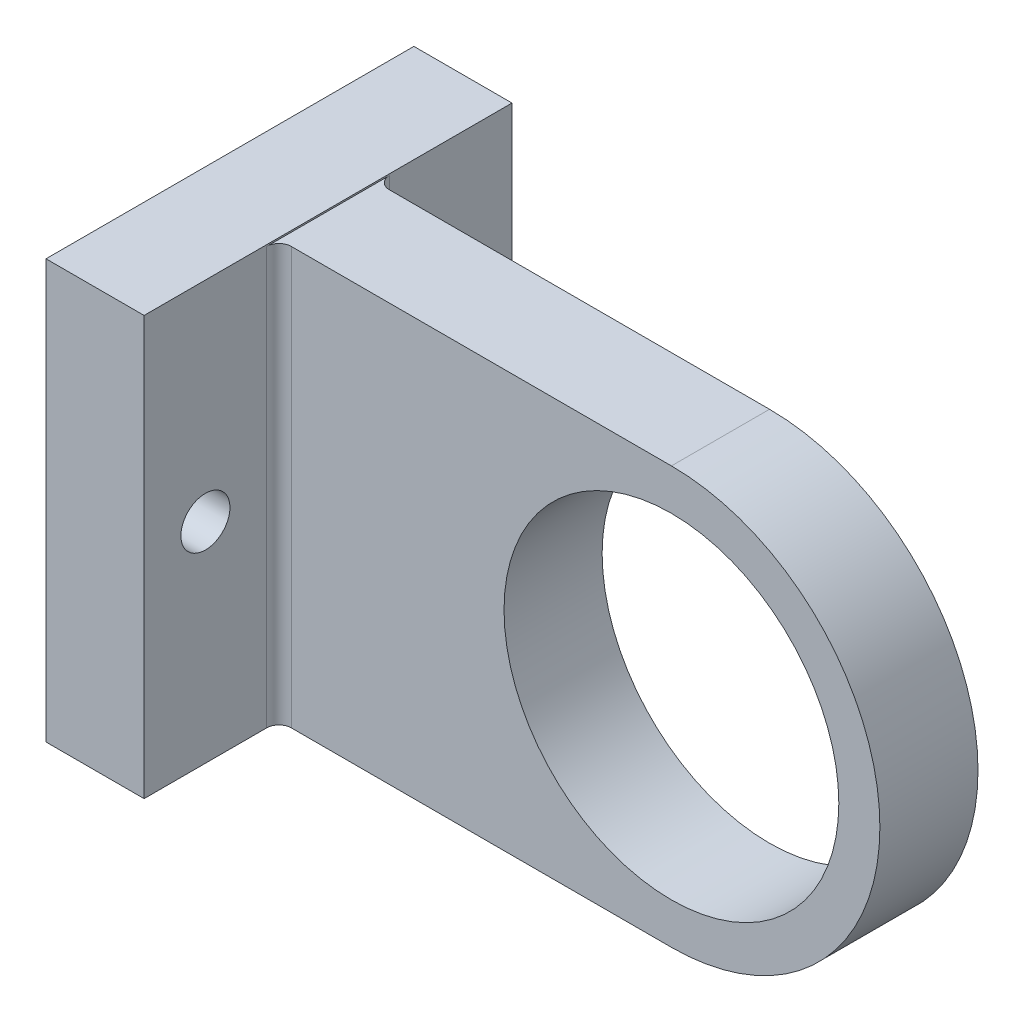
ISO-10303-21;
HEADER;
FILE_DESCRIPTION(('STEP AP214'),'2;1');
FILE_NAME('part.step','',(''),(''),'','','');
FILE_SCHEMA(('AUTOMOTIVE_DESIGN { 1 0 10303 214 1 1 1 1 }'));
ENDSEC;
DATA;
#1=APPLICATION_CONTEXT('core data for automotive mechanical design processes');
#2=APPLICATION_PROTOCOL_DEFINITION('international standard','automotive_design',2000,#1);
#3=PRODUCT_CONTEXT('',#1,'mechanical');
#4=PRODUCT('Part','Part','',(#3));
#5=PRODUCT_RELATED_PRODUCT_CATEGORY('part','',(#4));
#6=PRODUCT_DEFINITION_FORMATION('','',#4);
#7=PRODUCT_DEFINITION_CONTEXT('part definition',#1,'design');
#8=PRODUCT_DEFINITION('design','',#6,#7);
#9=PRODUCT_DEFINITION_SHAPE('','',#8);
#10=(LENGTH_UNIT() NAMED_UNIT(*) SI_UNIT(.MILLI.,.METRE.));
#11=(NAMED_UNIT(*) PLANE_ANGLE_UNIT() SI_UNIT($,.RADIAN.));
#12=(NAMED_UNIT(*) SI_UNIT($,.STERADIAN.) SOLID_ANGLE_UNIT());
#13=UNCERTAINTY_MEASURE_WITH_UNIT(LENGTH_MEASURE(1.E-05),#10,'distance_accuracy_value','');
#14=(GEOMETRIC_REPRESENTATION_CONTEXT(3) GLOBAL_UNCERTAINTY_ASSIGNED_CONTEXT((#13)) GLOBAL_UNIT_ASSIGNED_CONTEXT((#10,
#11,#12)) REPRESENTATION_CONTEXT('',''));
#15=CARTESIAN_POINT('',(0.,0.,0.));
#16=DIRECTION('',(0.,0.,1.));
#17=DIRECTION('',(1.,0.,0.));
#18=AXIS2_PLACEMENT_3D('',#15,#16,#17);
#19=CARTESIAN_POINT('',(22.9128784747792,-0.887716477004379,8.));
#20=DIRECTION('',(0.,0.,1.));
#21=DIRECTION('',(1.,0.,0.));
#22=AXIS2_PLACEMENT_3D('',#19,#20,#21);
#23=PLANE('',#22);
#24=CARTESIAN_POINT('',(22.9128784747792,-0.887716477004379,8.));
#25=DIRECTION('',(0.,0.,1.));
#26=DIRECTION('',(1.,0.,0.));
#27=AXIS2_PLACEMENT_3D('',#24,#25,#26);
#28=CIRCLE('',#27,13.65);
#29=CARTESIAN_POINT('',(36.5628784747792,-0.887716477004379,8.));
#30=VERTEX_POINT('',#29);
#31=EDGE_CURVE('E180',#30,#30,#28,.T.);
#32=ORIENTED_EDGE('',*,*,#31,.F.);
#33=EDGE_LOOP('',(#32));
#34=FACE_BOUND('',#33,.T.);
#35=DIRECTION('',(-1.,0.,0.));
#36=VECTOR('',#35,1.);
#37=CARTESIAN_POINT('',(22.9128784747792,16.1122835229956,8.));
#38=LINE('',#37,#36);
#39=CARTESIAN_POINT('',(22.9128784747792,16.1122835229956,8.));
#40=VERTEX_POINT('',#39);
#41=CARTESIAN_POINT('',(-8.0871215252208,16.1122835229956,8.));
#42=VERTEX_POINT('',#41);
#43=EDGE_CURVE('E192',#40,#42,#38,.T.);
#44=ORIENTED_EDGE('',*,*,#43,.T.);
#45=DIRECTION('',(0.,-1.,0.));
#46=VECTOR('',#45,1.);
#47=CARTESIAN_POINT('',(-8.0871215252208,-0.887716477004385,8.));
#48=LINE('',#47,#46);
#49=CARTESIAN_POINT('',(-8.0871215252208,-17.8877164770044,8.));
#50=VERTEX_POINT('',#49);
#51=EDGE_CURVE('E227',#42,#50,#48,.T.);
#52=ORIENTED_EDGE('',*,*,#51,.T.);
#53=DIRECTION('',(1.,0.,0.));
#54=VECTOR('',#53,1.);
#55=CARTESIAN_POINT('',(22.9128784747792,-17.8877164770044,8.));
#56=LINE('',#55,#54);
#57=CARTESIAN_POINT('',(22.9128784747792,-17.8877164770044,8.));
#58=VERTEX_POINT('',#57);
#59=EDGE_CURVE('E196',#50,#58,#56,.T.);
#60=ORIENTED_EDGE('',*,*,#59,.T.);
#61=CARTESIAN_POINT('',(22.9128784747792,-0.887716477004379,8.));
#62=DIRECTION('',(0.,0.,1.));
#63=DIRECTION('',(1.,0.,0.));
#64=AXIS2_PLACEMENT_3D('',#61,#62,#63);
#65=CIRCLE('',#64,17.);
#66=EDGE_CURVE('E188',#58,#40,#65,.T.);
#67=ORIENTED_EDGE('',*,*,#66,.T.);
#68=EDGE_LOOP('',(#44,#52,#60,#67));
#69=FACE_BOUND('',#68,.T.);
#70=ADVANCED_FACE('F39',(#34,#69),#23,.T.);
#71=CARTESIAN_POINT('',(22.9128784747792,-0.887716477004379,0.));
#72=DIRECTION('',(0.,0.,1.));
#73=DIRECTION('',(1.,0.,0.));
#74=AXIS2_PLACEMENT_3D('',#71,#72,#73);
#75=PLANE('',#74);
#76=CARTESIAN_POINT('',(22.9128784747792,-0.887716477004379,0.));
#77=DIRECTION('',(0.,0.,1.));
#78=DIRECTION('',(1.,0.,0.));
#79=AXIS2_PLACEMENT_3D('',#76,#77,#78);
#80=CIRCLE('',#79,13.65);
#81=CARTESIAN_POINT('',(36.5628784747792,-0.887716477004379,0.));
#82=VERTEX_POINT('',#81);
#83=EDGE_CURVE('E179',#82,#82,#80,.T.);
#84=ORIENTED_EDGE('',*,*,#83,.T.);
#85=EDGE_LOOP('',(#84));
#86=FACE_BOUND('',#85,.T.);
#87=DIRECTION('',(1.,0.,0.));
#88=VECTOR('',#87,1.);
#89=CARTESIAN_POINT('',(22.9128784747792,-17.8877164770044,0.));
#90=LINE('',#89,#88);
#91=CARTESIAN_POINT('',(-8.0871215252208,-17.8877164770044,0.));
#92=VERTEX_POINT('',#91);
#93=CARTESIAN_POINT('',(22.9128784747792,-17.8877164770044,0.));
#94=VERTEX_POINT('',#93);
#95=EDGE_CURVE('E193',#92,#94,#90,.T.);
#96=ORIENTED_EDGE('',*,*,#95,.F.);
#97=DIRECTION('',(0.,-1.,0.));
#98=VECTOR('',#97,1.);
#99=CARTESIAN_POINT('',(-8.0871215252208,16.1122835229956,0.));
#100=LINE('',#99,#98);
#101=CARTESIAN_POINT('',(-8.0871215252208,16.1122835229956,0.));
#102=VERTEX_POINT('',#101);
#103=EDGE_CURVE('E224',#92,#102,#100,.F.);
#104=ORIENTED_EDGE('',*,*,#103,.T.);
#105=DIRECTION('',(-1.,0.,0.));
#106=VECTOR('',#105,1.);
#107=CARTESIAN_POINT('',(22.9128784747792,16.1122835229956,0.));
#108=LINE('',#107,#106);
#109=CARTESIAN_POINT('',(22.9128784747792,16.1122835229956,0.));
#110=VERTEX_POINT('',#109);
#111=EDGE_CURVE('E203',#110,#102,#108,.T.);
#112=ORIENTED_EDGE('',*,*,#111,.F.);
#113=CARTESIAN_POINT('',(22.9128784747792,-0.887716477004379,0.));
#114=DIRECTION('',(0.,0.,1.));
#115=DIRECTION('',(1.,0.,0.));
#116=AXIS2_PLACEMENT_3D('',#113,#114,#115);
#117=CIRCLE('',#116,17.);
#118=EDGE_CURVE('E184',#94,#110,#117,.T.);
#119=ORIENTED_EDGE('',*,*,#118,.F.);
#120=EDGE_LOOP('',(#96,#104,#112,#119));
#121=FACE_BOUND('',#120,.T.);
#122=ADVANCED_FACE('F286',(#86,#121),#75,.F.);
#123=CARTESIAN_POINT('',(22.9128784747792,16.1122835229956,8.));
#124=DIRECTION('',(0.,-1.,0.));
#125=DIRECTION('',(0.,0.,-1.));
#126=AXIS2_PLACEMENT_3D('',#123,#124,#125);
#127=PLANE('',#126);
#128=DIRECTION('',(0.,0.,-1.));
#129=VECTOR('',#128,1.);
#130=CARTESIAN_POINT('',(-9.0871215252208,16.1122835229956,8.));
#131=LINE('',#130,#129);
#132=CARTESIAN_POINT('',(-9.0871215252208,16.1122835229956,9.));
#133=VERTEX_POINT('',#132);
#134=CARTESIAN_POINT('',(-9.0871215252208,16.1122835229956,-1.));
#135=VERTEX_POINT('',#134);
#136=EDGE_CURVE('E171',#133,#135,#131,.T.);
#137=ORIENTED_EDGE('',*,*,#136,.F.);
#138=CARTESIAN_POINT('',(-8.0871215252208,16.1122835229956,9.));
#139=DIRECTION('',(0.,-1.,0.));
#140=DIRECTION('',(0.,0.,-1.));
#141=AXIS2_PLACEMENT_3D('',#138,#139,#140);
#142=CIRCLE('',#141,1.);
#143=EDGE_CURVE('E11',#133,#42,#142,.T.);
#144=ORIENTED_EDGE('',*,*,#143,.T.);
#145=ORIENTED_EDGE('',*,*,#43,.F.);
#146=DIRECTION('',(0.,0.,-1.));
#147=VECTOR('',#146,1.);
#148=CARTESIAN_POINT('',(22.9128784747792,16.1122835229956,8.));
#149=LINE('',#148,#147);
#150=EDGE_CURVE('E214',#40,#110,#149,.T.);
#151=ORIENTED_EDGE('',*,*,#150,.T.);
#152=ORIENTED_EDGE('',*,*,#111,.T.);
#153=CARTESIAN_POINT('',(-8.0871215252208,16.1122835229956,-1.));
#154=DIRECTION('',(0.,-1.,0.));
#155=DIRECTION('',(0.,0.,-1.));
#156=AXIS2_PLACEMENT_3D('',#153,#154,#155);
#157=CIRCLE('',#156,1.);
#158=EDGE_CURVE('E233',#102,#135,#157,.T.);
#159=ORIENTED_EDGE('',*,*,#158,.T.);
#160=EDGE_LOOP('',(#137,#144,#145,#151,#152,#159));
#161=FACE_BOUND('',#160,.T.);
#162=ADVANCED_FACE('F280',(#161),#127,.F.);
#163=CARTESIAN_POINT('',(22.9128784747792,-0.887716477004379,8.));
#164=DIRECTION('',(0.,0.,-1.));
#165=DIRECTION('',(-1.,0.,0.));
#166=AXIS2_PLACEMENT_3D('',#163,#164,#165);
#167=CYLINDRICAL_SURFACE('',#166,17.);
#168=ORIENTED_EDGE('',*,*,#118,.T.);
#169=ORIENTED_EDGE('',*,*,#150,.F.);
#170=ORIENTED_EDGE('',*,*,#66,.F.);
#171=DIRECTION('',(0.,0.,-1.));
#172=VECTOR('',#171,1.);
#173=CARTESIAN_POINT('',(22.9128784747792,-17.8877164770044,8.));
#174=LINE('',#173,#172);
#175=EDGE_CURVE('E199',#58,#94,#174,.T.);
#176=ORIENTED_EDGE('',*,*,#175,.T.);
#177=EDGE_LOOP('',(#168,#169,#170,#176));
#178=FACE_BOUND('',#177,.T.);
#179=ADVANCED_FACE('F260',(#178),#167,.T.);
#180=CARTESIAN_POINT('',(-17.0871215252208,16.1122835229956,8.));
#181=DIRECTION('',(1.,0.,0.));
#182=DIRECTION('',(0.,1.,0.));
#183=AXIS2_PLACEMENT_3D('',#180,#181,#182);
#184=PLANE('',#183);
#185=CARTESIAN_POINT('',(-17.0871215252208,-0.82426124868314,14.));
#186=DIRECTION('',(-1.,0.,0.));
#187=DIRECTION('',(0.,-1.,0.));
#188=AXIS2_PLACEMENT_3D('',#185,#186,#187);
#189=CIRCLE('',#188,2.);
#190=CARTESIAN_POINT('',(-17.0871215252208,-2.82426124868314,14.));
#191=VERTEX_POINT('',#190);
#192=EDGE_CURVE('E241',#191,#191,#189,.T.);
#193=ORIENTED_EDGE('',*,*,#192,.F.);
#194=EDGE_LOOP('',(#193));
#195=FACE_BOUND('',#194,.T.);
#196=CARTESIAN_POINT('',(-17.0871215252208,-0.82426124868314,-6.));
#197=DIRECTION('',(-1.,0.,0.));
#198=DIRECTION('',(0.,-1.,0.));
#199=AXIS2_PLACEMENT_3D('',#196,#197,#198);
#200=CIRCLE('',#199,2.);
#201=CARTESIAN_POINT('',(-17.0871215252208,-2.82426124868314,-6.));
#202=VERTEX_POINT('',#201);
#203=EDGE_CURVE('E155',#202,#202,#200,.T.);
#204=ORIENTED_EDGE('',*,*,#203,.F.);
#205=EDGE_LOOP('',(#204));
#206=FACE_BOUND('',#205,.T.);
#207=DIRECTION('',(0.,0.,-1.));
#208=VECTOR('',#207,1.);
#209=CARTESIAN_POINT('',(-17.0871215252208,-17.8877164770044,8.));
#210=LINE('',#209,#208);
#211=CARTESIAN_POINT('',(-17.0871215252208,-17.8877164770044,19.));
#212=VERTEX_POINT('',#211);
#213=CARTESIAN_POINT('',(-17.0871215252208,-17.8877164770044,-11.));
#214=VERTEX_POINT('',#213);
#215=EDGE_CURVE('E122',#212,#214,#210,.T.);
#216=ORIENTED_EDGE('',*,*,#215,.F.);
#217=DIRECTION('',(0.,1.,0.));
#218=VECTOR('',#217,1.);
#219=CARTESIAN_POINT('',(-17.0871215252208,16.2391939796381,19.));
#220=LINE('',#219,#218);
#221=CARTESIAN_POINT('',(-17.0871215252208,16.2391939796381,19.));
#222=VERTEX_POINT('',#221);
#223=EDGE_CURVE('E152',#212,#222,#220,.T.);
#224=ORIENTED_EDGE('',*,*,#223,.T.);
#225=DIRECTION('',(0.,0.,-1.));
#226=VECTOR('',#225,1.);
#227=CARTESIAN_POINT('',(-17.0871215252208,16.2391939796381,-11.));
#228=LINE('',#227,#226);
#229=CARTESIAN_POINT('',(-17.0871215252208,16.2391939796381,-11.));
#230=VERTEX_POINT('',#229);
#231=EDGE_CURVE('E147',#222,#230,#228,.T.);
#232=ORIENTED_EDGE('',*,*,#231,.T.);
#233=DIRECTION('',(0.,-1.,0.));
#234=VECTOR('',#233,1.);
#235=CARTESIAN_POINT('',(-17.0871215252208,16.2391939796381,-11.));
#236=LINE('',#235,#234);
#237=EDGE_CURVE('E163',#230,#214,#236,.T.);
#238=ORIENTED_EDGE('',*,*,#237,.T.);
#239=EDGE_LOOP('',(#216,#224,#232,#238));
#240=FACE_BOUND('',#239,.T.);
#241=ADVANCED_FACE('F257',(#195,#206,#240),#184,.F.);
#242=CARTESIAN_POINT('',(22.9128784747792,-17.8877164770044,8.));
#243=DIRECTION('',(0.,1.,0.));
#244=DIRECTION('',(-1.,0.,0.));
#245=AXIS2_PLACEMENT_3D('',#242,#243,#244);
#246=PLANE('',#245);
#247=ORIENTED_EDGE('',*,*,#215,.T.);
#248=DIRECTION('',(-1.,0.,0.));
#249=VECTOR('',#248,1.);
#250=CARTESIAN_POINT('',(-9.0871215252208,-17.8877164770044,-11.));
#251=LINE('',#250,#249);
#252=CARTESIAN_POINT('',(-9.0871215252208,-17.8877164770044,-11.));
#253=VERTEX_POINT('',#252);
#254=EDGE_CURVE('E117',#253,#214,#251,.T.);
#255=ORIENTED_EDGE('',*,*,#254,.F.);
#256=DIRECTION('',(0.,0.,1.));
#257=VECTOR('',#256,1.);
#258=CARTESIAN_POINT('',(-9.0871215252208,-17.8877164770044,-11.));
#259=LINE('',#258,#257);
#260=CARTESIAN_POINT('',(-9.0871215252208,-17.8877164770044,-1.));
#261=VERTEX_POINT('',#260);
#262=EDGE_CURVE('E120',#253,#261,#259,.T.);
#263=ORIENTED_EDGE('',*,*,#262,.T.);
#264=CARTESIAN_POINT('',(-8.0871215252208,-17.8877164770044,-1.));
#265=DIRECTION('',(0.,1.,0.));
#266=DIRECTION('',(-1.,0.,0.));
#267=AXIS2_PLACEMENT_3D('',#264,#265,#266);
#268=CIRCLE('',#267,1.);
#269=EDGE_CURVE('E230',#261,#92,#268,.T.);
#270=ORIENTED_EDGE('',*,*,#269,.T.);
#271=ORIENTED_EDGE('',*,*,#95,.T.);
#272=ORIENTED_EDGE('',*,*,#175,.F.);
#273=ORIENTED_EDGE('',*,*,#59,.F.);
#274=CARTESIAN_POINT('',(-8.0871215252208,-17.8877164770044,9.));
#275=DIRECTION('',(0.,1.,0.));
#276=DIRECTION('',(-1.,0.,0.));
#277=AXIS2_PLACEMENT_3D('',#274,#275,#276);
#278=CIRCLE('',#277,1.);
#279=CARTESIAN_POINT('',(-9.0871215252208,-17.8877164770044,9.));
#280=VERTEX_POINT('',#279);
#281=EDGE_CURVE('E49',#50,#280,#278,.T.);
#282=ORIENTED_EDGE('',*,*,#281,.T.);
#283=CARTESIAN_POINT('',(-9.0871215252208,-17.8877164770044,19.));
#284=VERTEX_POINT('',#283);
#285=EDGE_CURVE('E142',#280,#284,#259,.T.);
#286=ORIENTED_EDGE('',*,*,#285,.T.);
#287=DIRECTION('',(-1.,0.,0.));
#288=VECTOR('',#287,1.);
#289=CARTESIAN_POINT('',(-9.0871215252208,-17.8877164770044,19.));
#290=LINE('',#289,#288);
#291=EDGE_CURVE('E128',#284,#212,#290,.T.);
#292=ORIENTED_EDGE('',*,*,#291,.T.);
#293=EDGE_LOOP('',(#247,#255,#263,#270,#271,#272,#273,#282,#286,#292));
#294=FACE_BOUND('',#293,.T.);
#295=ADVANCED_FACE('F119',(#294),#246,.F.);
#296=CARTESIAN_POINT('',(22.9128784747792,-0.887716477004379,8.));
#297=DIRECTION('',(0.,0.,-1.));
#298=DIRECTION('',(-1.,0.,0.));
#299=AXIS2_PLACEMENT_3D('',#296,#297,#298);
#300=CYLINDRICAL_SURFACE('',#299,13.65);
#301=ORIENTED_EDGE('',*,*,#31,.T.);
#302=EDGE_LOOP('',(#301));
#303=FACE_BOUND('',#302,.T.);
#304=ORIENTED_EDGE('',*,*,#83,.F.);
#305=EDGE_LOOP('',(#304));
#306=FACE_BOUND('',#305,.T.);
#307=ADVANCED_FACE('F300',(#303,#306),#300,.F.);
#308=CARTESIAN_POINT('',(-9.08712152522081,16.2391939796381,-11.));
#309=DIRECTION('',(0.,0.,-1.));
#310=DIRECTION('',(0.,1.,0.));
#311=AXIS2_PLACEMENT_3D('',#308,#309,#310);
#312=PLANE('',#311);
#313=ORIENTED_EDGE('',*,*,#237,.F.);
#314=DIRECTION('',(-1.,0.,0.));
#315=VECTOR('',#314,1.);
#316=CARTESIAN_POINT('',(-9.08712152522081,16.2391939796381,-11.));
#317=LINE('',#316,#315);
#318=CARTESIAN_POINT('',(-9.08712152522081,16.2391939796381,-11.));
#319=VERTEX_POINT('',#318);
#320=EDGE_CURVE('E145',#319,#230,#317,.T.);
#321=ORIENTED_EDGE('',*,*,#320,.F.);
#322=DIRECTION('',(0.,-1.,0.));
#323=VECTOR('',#322,1.);
#324=CARTESIAN_POINT('',(-9.08712152522081,16.2391939796381,-11.));
#325=LINE('',#324,#323);
#326=EDGE_CURVE('E136',#319,#253,#325,.T.);
#327=ORIENTED_EDGE('',*,*,#326,.T.);
#328=ORIENTED_EDGE('',*,*,#254,.T.);
#329=EDGE_LOOP('',(#313,#321,#327,#328));
#330=FACE_BOUND('',#329,.T.);
#331=ADVANCED_FACE('F144',(#330),#312,.T.);
#332=CARTESIAN_POINT('',(-9.08712152522081,16.2391939796381,-11.));
#333=DIRECTION('',(0.,1.,0.));
#334=DIRECTION('',(0.,0.,1.));
#335=AXIS2_PLACEMENT_3D('',#332,#333,#334);
#336=PLANE('',#335);
#337=ORIENTED_EDGE('',*,*,#231,.F.);
#338=DIRECTION('',(-1.,0.,0.));
#339=VECTOR('',#338,1.);
#340=CARTESIAN_POINT('',(-9.08712152522081,16.2391939796381,19.));
#341=LINE('',#340,#339);
#342=CARTESIAN_POINT('',(-9.08712152522081,16.2391939796381,19.));
#343=VERTEX_POINT('',#342);
#344=EDGE_CURVE('E172',#343,#222,#341,.T.);
#345=ORIENTED_EDGE('',*,*,#344,.F.);
#346=DIRECTION('',(0.,0.,-1.));
#347=VECTOR('',#346,1.);
#348=CARTESIAN_POINT('',(-9.08712152522081,16.2391939796381,-11.));
#349=LINE('',#348,#347);
#350=EDGE_CURVE('E129',#343,#319,#349,.T.);
#351=ORIENTED_EDGE('',*,*,#350,.T.);
#352=ORIENTED_EDGE('',*,*,#320,.T.);
#353=EDGE_LOOP('',(#337,#345,#351,#352));
#354=FACE_BOUND('',#353,.T.);
#355=ADVANCED_FACE('F271',(#354),#336,.T.);
#356=CARTESIAN_POINT('',(-9.08712152522081,16.2391939796381,19.));
#357=DIRECTION('',(0.,0.,1.));
#358=DIRECTION('',(0.,-1.,0.));
#359=AXIS2_PLACEMENT_3D('',#356,#357,#358);
#360=PLANE('',#359);
#361=ORIENTED_EDGE('',*,*,#223,.F.);
#362=ORIENTED_EDGE('',*,*,#291,.F.);
#363=DIRECTION('',(0.,1.,0.));
#364=VECTOR('',#363,1.);
#365=CARTESIAN_POINT('',(-9.08712152522081,16.2391939796381,19.));
#366=LINE('',#365,#364);
#367=EDGE_CURVE('E141',#284,#343,#366,.T.);
#368=ORIENTED_EDGE('',*,*,#367,.T.);
#369=ORIENTED_EDGE('',*,*,#344,.T.);
#370=EDGE_LOOP('',(#361,#362,#368,#369));
#371=FACE_BOUND('',#370,.T.);
#372=ADVANCED_FACE('F269',(#371),#360,.T.);
#373=CARTESIAN_POINT('',(-9.0871215252208,0.,0.));
#374=DIRECTION('',(-1.,0.,0.));
#375=DIRECTION('',(0.,-1.,0.));
#376=AXIS2_PLACEMENT_3D('',#373,#374,#375);
#377=PLANE('',#376);
#378=CARTESIAN_POINT('',(-9.0871215252208,-0.824261248683138,14.));
#379=DIRECTION('',(-1.,0.,0.));
#380=DIRECTION('',(0.,-1.,0.));
#381=AXIS2_PLACEMENT_3D('',#378,#379,#380);
#382=CIRCLE('',#381,2.);
#383=CARTESIAN_POINT('',(-9.0871215252208,-2.82426124868314,14.));
#384=VERTEX_POINT('',#383);
#385=EDGE_CURVE('E43',#384,#384,#382,.T.);
#386=ORIENTED_EDGE('',*,*,#385,.T.);
#387=EDGE_LOOP('',(#386));
#388=FACE_BOUND('',#387,.T.);
#389=CARTESIAN_POINT('',(-9.0871215252208,-0.824261248683137,-6.));
#390=DIRECTION('',(-1.,0.,0.));
#391=DIRECTION('',(0.,-1.,0.));
#392=AXIS2_PLACEMENT_3D('',#389,#390,#391);
#393=CIRCLE('',#392,2.);
#394=CARTESIAN_POINT('',(-9.0871215252208,-2.82426124868314,-6.));
#395=VERTEX_POINT('',#394);
#396=EDGE_CURVE('E238',#395,#395,#393,.T.);
#397=ORIENTED_EDGE('',*,*,#396,.T.);
#398=EDGE_LOOP('',(#397));
#399=FACE_BOUND('',#398,.T.);
#400=ORIENTED_EDGE('',*,*,#136,.T.);
#401=DIRECTION('',(0.,-1.,0.));
#402=VECTOR('',#401,1.);
#403=CARTESIAN_POINT('',(-9.0871215252208,-17.8877164770044,-1.));
#404=LINE('',#403,#402);
#405=EDGE_CURVE('E139',#135,#261,#404,.T.);
#406=ORIENTED_EDGE('',*,*,#405,.T.);
#407=ORIENTED_EDGE('',*,*,#262,.F.);
#408=ORIENTED_EDGE('',*,*,#326,.F.);
#409=ORIENTED_EDGE('',*,*,#350,.F.);
#410=ORIENTED_EDGE('',*,*,#367,.F.);
#411=ORIENTED_EDGE('',*,*,#285,.F.);
#412=DIRECTION('',(0.,-1.,0.));
#413=VECTOR('',#412,1.);
#414=CARTESIAN_POINT('',(-9.0871215252208,0.,9.));
#415=LINE('',#414,#413);
#416=EDGE_CURVE('E218',#280,#133,#415,.F.);
#417=ORIENTED_EDGE('',*,*,#416,.T.);
#418=EDGE_LOOP('',(#400,#406,#407,#408,#409,#410,#411,#417));
#419=FACE_BOUND('',#418,.T.);
#420=ADVANCED_FACE('F134',(#388,#399,#419),#377,.F.);
#421=CARTESIAN_POINT('',(-8.0871215252208,0.,-1.));
#422=DIRECTION('',(0.,1.,0.));
#423=DIRECTION('',(-1.,0.,0.));
#424=AXIS2_PLACEMENT_3D('',#421,#422,#423);
#425=CYLINDRICAL_SURFACE('',#424,1.);
#426=ORIENTED_EDGE('',*,*,#158,.F.);
#427=ORIENTED_EDGE('',*,*,#103,.F.);
#428=ORIENTED_EDGE('',*,*,#269,.F.);
#429=ORIENTED_EDGE('',*,*,#405,.F.);
#430=EDGE_LOOP('',(#426,#427,#428,#429));
#431=FACE_BOUND('',#430,.T.);
#432=ADVANCED_FACE('F285',(#431),#425,.F.);
#433=CARTESIAN_POINT('',(-8.0871215252208,-0.887716477004385,9.));
#434=DIRECTION('',(0.,-1.,0.));
#435=DIRECTION('',(1.,0.,0.));
#436=AXIS2_PLACEMENT_3D('',#433,#434,#435);
#437=CYLINDRICAL_SURFACE('',#436,1.);
#438=ORIENTED_EDGE('',*,*,#143,.F.);
#439=ORIENTED_EDGE('',*,*,#416,.F.);
#440=ORIENTED_EDGE('',*,*,#281,.F.);
#441=ORIENTED_EDGE('',*,*,#51,.F.);
#442=EDGE_LOOP('',(#438,#439,#440,#441));
#443=FACE_BOUND('',#442,.T.);
#444=ADVANCED_FACE('F41',(#443),#437,.F.);
#445=CARTESIAN_POINT('',(39.9128784747792,-0.824261248683122,-6.));
#446=DIRECTION('',(-1.,0.,0.));
#447=DIRECTION('',(0.,-1.,0.));
#448=AXIS2_PLACEMENT_3D('',#445,#446,#447);
#449=CYLINDRICAL_SURFACE('',#448,2.);
#450=ORIENTED_EDGE('',*,*,#203,.T.);
#451=EDGE_LOOP('',(#450));
#452=FACE_BOUND('',#451,.T.);
#453=ORIENTED_EDGE('',*,*,#396,.F.);
#454=EDGE_LOOP('',(#453));
#455=FACE_BOUND('',#454,.T.);
#456=ADVANCED_FACE('F254',(#452,#455),#449,.F.);
#457=CARTESIAN_POINT('',(39.9128784747792,-0.824261248683123,14.));
#458=DIRECTION('',(-1.,0.,0.));
#459=DIRECTION('',(0.,-1.,0.));
#460=AXIS2_PLACEMENT_3D('',#457,#458,#459);
#461=CYLINDRICAL_SURFACE('',#460,2.);
#462=ORIENTED_EDGE('',*,*,#192,.T.);
#463=EDGE_LOOP('',(#462));
#464=FACE_BOUND('',#463,.T.);
#465=ORIENTED_EDGE('',*,*,#385,.F.);
#466=EDGE_LOOP('',(#465));
#467=FACE_BOUND('',#466,.T.);
#468=ADVANCED_FACE('F393',(#464,#467),#461,.F.);
#469=CLOSED_SHELL('',(#70,#122,#162,#179,#241,#295,#307,#331,#355,#372,#420,#432,#444,#456,#468));
#470=MANIFOLD_SOLID_BREP('B2',#469);
#471=ADVANCED_BREP_SHAPE_REPRESENTATION('',(#18,#470),#14);
#472=SHAPE_DEFINITION_REPRESENTATION(#9,#471);
ENDSEC;
END-ISO-10303-21;
